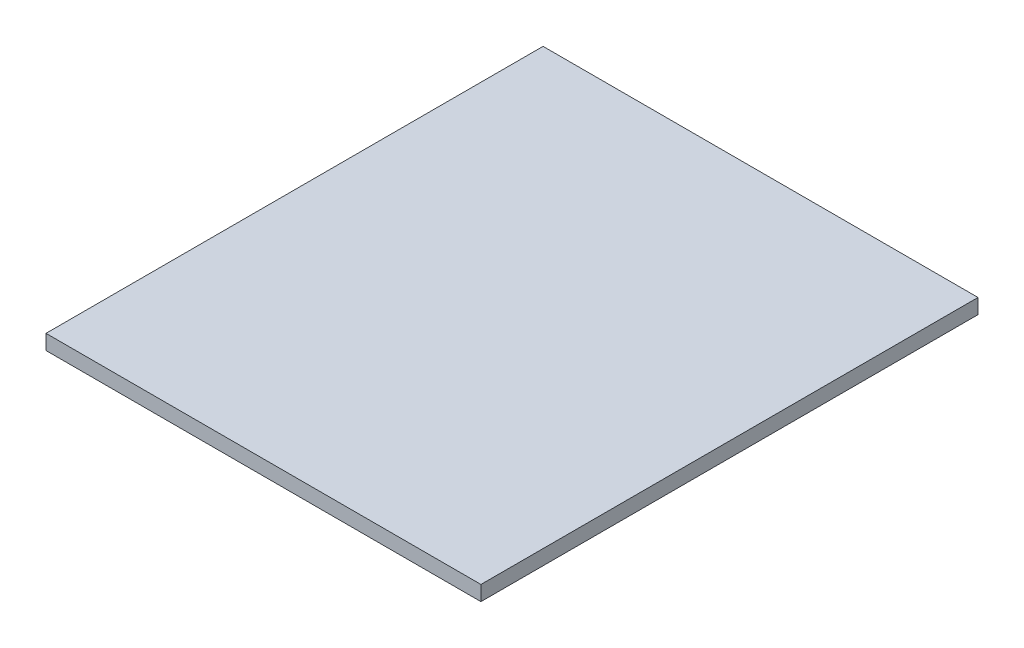
ISO-10303-21;
HEADER;
FILE_DESCRIPTION(('STEP AP214'),'2;1');
FILE_NAME('part.step','',(''),(''),'','','');
FILE_SCHEMA(('AUTOMOTIVE_DESIGN { 1 0 10303 214 1 1 1 1 }'));
ENDSEC;
DATA;
#1=APPLICATION_CONTEXT('core data for automotive mechanical design processes');
#2=APPLICATION_PROTOCOL_DEFINITION('international standard','automotive_design',2000,#1);
#3=PRODUCT_CONTEXT('',#1,'mechanical');
#4=PRODUCT('Part','Part','',(#3));
#5=PRODUCT_RELATED_PRODUCT_CATEGORY('part','',(#4));
#6=PRODUCT_DEFINITION_FORMATION('','',#4);
#7=PRODUCT_DEFINITION_CONTEXT('part definition',#1,'design');
#8=PRODUCT_DEFINITION('design','',#6,#7);
#9=PRODUCT_DEFINITION_SHAPE('','',#8);
#10=(LENGTH_UNIT() NAMED_UNIT(*) SI_UNIT(.MILLI.,.METRE.));
#11=(NAMED_UNIT(*) PLANE_ANGLE_UNIT() SI_UNIT($,.RADIAN.));
#12=(NAMED_UNIT(*) SI_UNIT($,.STERADIAN.) SOLID_ANGLE_UNIT());
#13=UNCERTAINTY_MEASURE_WITH_UNIT(LENGTH_MEASURE(1.E-05),#10,'distance_accuracy_value','');
#14=(GEOMETRIC_REPRESENTATION_CONTEXT(3) GLOBAL_UNCERTAINTY_ASSIGNED_CONTEXT((#13)) GLOBAL_UNIT_ASSIGNED_CONTEXT((#10,
#11,#12)) REPRESENTATION_CONTEXT('',''));
#15=CARTESIAN_POINT('',(0.,0.,0.));
#16=DIRECTION('',(0.,0.,1.));
#17=DIRECTION('',(1.,0.,0.));
#18=AXIS2_PLACEMENT_3D('',#15,#16,#17);
#19=CARTESIAN_POINT('',(87.4999999999999,6.,100.));
#20=DIRECTION('',(-1.,0.,0.));
#21=DIRECTION('',(0.,0.,1.));
#22=AXIS2_PLACEMENT_3D('',#19,#20,#21);
#23=PLANE('',#22);
#24=DIRECTION('',(0.,0.,-1.));
#25=VECTOR('',#24,1.);
#26=CARTESIAN_POINT('',(87.4999999999999,0.,100.));
#27=LINE('',#26,#25);
#28=CARTESIAN_POINT('',(87.4999999999999,0.,100.));
#29=VERTEX_POINT('',#28);
#30=CARTESIAN_POINT('',(87.4999999999999,0.,-100.));
#31=VERTEX_POINT('',#30);
#32=EDGE_CURVE('E113',#29,#31,#27,.T.);
#33=ORIENTED_EDGE('',*,*,#32,.T.);
#34=DIRECTION('',(0.,-1.,0.));
#35=VECTOR('',#34,1.);
#36=CARTESIAN_POINT('',(87.4999999999999,6.,-100.));
#37=LINE('',#36,#35);
#38=CARTESIAN_POINT('',(87.4999999999999,6.,-100.));
#39=VERTEX_POINT('',#38);
#40=EDGE_CURVE('E11',#39,#31,#37,.T.);
#41=ORIENTED_EDGE('',*,*,#40,.F.);
#42=DIRECTION('',(0.,0.,-1.));
#43=VECTOR('',#42,1.);
#44=CARTESIAN_POINT('',(87.4999999999999,6.,100.));
#45=LINE('',#44,#43);
#46=CARTESIAN_POINT('',(87.4999999999999,6.,100.));
#47=VERTEX_POINT('',#46);
#48=EDGE_CURVE('E97',#47,#39,#45,.T.);
#49=ORIENTED_EDGE('',*,*,#48,.F.);
#50=DIRECTION('',(0.,-1.,0.));
#51=VECTOR('',#50,1.);
#52=CARTESIAN_POINT('',(87.4999999999999,6.,100.));
#53=LINE('',#52,#51);
#54=EDGE_CURVE('E109',#47,#29,#53,.T.);
#55=ORIENTED_EDGE('',*,*,#54,.T.);
#56=EDGE_LOOP('',(#33,#41,#49,#55));
#57=FACE_BOUND('',#56,.T.);
#58=ADVANCED_FACE('F45',(#57),#23,.F.);
#59=CARTESIAN_POINT('',(-87.5000000000001,6.,-100.));
#60=DIRECTION('',(0.,0.,1.));
#61=DIRECTION('',(1.,0.,0.));
#62=AXIS2_PLACEMENT_3D('',#59,#60,#61);
#63=PLANE('',#62);
#64=DIRECTION('',(-1.,0.,0.));
#65=VECTOR('',#64,1.);
#66=CARTESIAN_POINT('',(-87.5000000000001,0.,-100.));
#67=LINE('',#66,#65);
#68=CARTESIAN_POINT('',(-87.5000000000001,0.,-100.));
#69=VERTEX_POINT('',#68);
#70=EDGE_CURVE('E102',#31,#69,#67,.T.);
#71=ORIENTED_EDGE('',*,*,#70,.T.);
#72=DIRECTION('',(0.,-1.,0.));
#73=VECTOR('',#72,1.);
#74=CARTESIAN_POINT('',(-87.5000000000001,6.,-100.));
#75=LINE('',#74,#73);
#76=CARTESIAN_POINT('',(-87.5000000000001,6.,-100.));
#77=VERTEX_POINT('',#76);
#78=EDGE_CURVE('E54',#77,#69,#75,.T.);
#79=ORIENTED_EDGE('',*,*,#78,.F.);
#80=DIRECTION('',(-1.,0.,0.));
#81=VECTOR('',#80,1.);
#82=CARTESIAN_POINT('',(-87.5000000000001,6.,-100.));
#83=LINE('',#82,#81);
#84=EDGE_CURVE('E92',#39,#77,#83,.T.);
#85=ORIENTED_EDGE('',*,*,#84,.F.);
#86=ORIENTED_EDGE('',*,*,#40,.T.);
#87=EDGE_LOOP('',(#71,#79,#85,#86));
#88=FACE_BOUND('',#87,.T.);
#89=ADVANCED_FACE('F101',(#88),#63,.F.);
#90=CARTESIAN_POINT('',(-87.5000000000001,6.,100.));
#91=DIRECTION('',(1.,0.,0.));
#92=DIRECTION('',(0.,0.,-1.));
#93=AXIS2_PLACEMENT_3D('',#90,#91,#92);
#94=PLANE('',#93);
#95=DIRECTION('',(0.,0.,1.));
#96=VECTOR('',#95,1.);
#97=CARTESIAN_POINT('',(-87.5000000000001,0.,100.));
#98=LINE('',#97,#96);
#99=CARTESIAN_POINT('',(-87.5000000000001,0.,100.));
#100=VERTEX_POINT('',#99);
#101=EDGE_CURVE('E79',#69,#100,#98,.T.);
#102=ORIENTED_EDGE('',*,*,#101,.T.);
#103=DIRECTION('',(0.,-1.,0.));
#104=VECTOR('',#103,1.);
#105=CARTESIAN_POINT('',(-87.5000000000001,6.,100.));
#106=LINE('',#105,#104);
#107=CARTESIAN_POINT('',(-87.5000000000001,6.,100.));
#108=VERTEX_POINT('',#107);
#109=EDGE_CURVE('E104',#108,#100,#106,.T.);
#110=ORIENTED_EDGE('',*,*,#109,.F.);
#111=DIRECTION('',(0.,0.,1.));
#112=VECTOR('',#111,1.);
#113=CARTESIAN_POINT('',(-87.5000000000001,6.,100.));
#114=LINE('',#113,#112);
#115=EDGE_CURVE('E95',#77,#108,#114,.T.);
#116=ORIENTED_EDGE('',*,*,#115,.F.);
#117=ORIENTED_EDGE('',*,*,#78,.T.);
#118=EDGE_LOOP('',(#102,#110,#116,#117));
#119=FACE_BOUND('',#118,.T.);
#120=ADVANCED_FACE('F105',(#119),#94,.F.);
#121=CARTESIAN_POINT('',(-87.5000000000001,6.,100.));
#122=DIRECTION('',(0.,0.,-1.));
#123=DIRECTION('',(-1.,0.,0.));
#124=AXIS2_PLACEMENT_3D('',#121,#122,#123);
#125=PLANE('',#124);
#126=DIRECTION('',(1.,0.,0.));
#127=VECTOR('',#126,1.);
#128=CARTESIAN_POINT('',(-87.5000000000001,0.,100.));
#129=LINE('',#128,#127);
#130=EDGE_CURVE('E85',#100,#29,#129,.T.);
#131=ORIENTED_EDGE('',*,*,#130,.T.);
#132=ORIENTED_EDGE('',*,*,#54,.F.);
#133=DIRECTION('',(1.,0.,0.));
#134=VECTOR('',#133,1.);
#135=CARTESIAN_POINT('',(-87.5000000000001,6.,100.));
#136=LINE('',#135,#134);
#137=EDGE_CURVE('E62',#108,#47,#136,.T.);
#138=ORIENTED_EDGE('',*,*,#137,.F.);
#139=ORIENTED_EDGE('',*,*,#109,.T.);
#140=EDGE_LOOP('',(#131,#132,#138,#139));
#141=FACE_BOUND('',#140,.T.);
#142=ADVANCED_FACE('F126',(#141),#125,.F.);
#143=CARTESIAN_POINT('',(0.,6.,0.));
#144=DIRECTION('',(0.,-1.,0.));
#145=DIRECTION('',(0.,0.,-1.));
#146=AXIS2_PLACEMENT_3D('',#143,#144,#145);
#147=PLANE('',#146);
#148=ORIENTED_EDGE('',*,*,#48,.T.);
#149=ORIENTED_EDGE('',*,*,#84,.T.);
#150=ORIENTED_EDGE('',*,*,#115,.T.);
#151=ORIENTED_EDGE('',*,*,#137,.T.);
#152=EDGE_LOOP('',(#148,#149,#150,#151));
#153=FACE_BOUND('',#152,.T.);
#154=ADVANCED_FACE('F93',(#153),#147,.F.);
#155=CARTESIAN_POINT('',(0.,0.,0.));
#156=DIRECTION('',(0.,-1.,0.));
#157=DIRECTION('',(0.,0.,-1.));
#158=AXIS2_PLACEMENT_3D('',#155,#156,#157);
#159=PLANE('',#158);
#160=ORIENTED_EDGE('',*,*,#32,.F.);
#161=ORIENTED_EDGE('',*,*,#130,.F.);
#162=ORIENTED_EDGE('',*,*,#101,.F.);
#163=ORIENTED_EDGE('',*,*,#70,.F.);
#164=EDGE_LOOP('',(#160,#161,#162,#163));
#165=FACE_BOUND('',#164,.T.);
#166=ADVANCED_FACE('F129',(#165),#159,.T.);
#167=CLOSED_SHELL('',(#58,#89,#120,#142,#154,#166));
#168=MANIFOLD_SOLID_BREP('B2',#167);
#169=ADVANCED_BREP_SHAPE_REPRESENTATION('',(#18,#168),#14);
#170=SHAPE_DEFINITION_REPRESENTATION(#9,#169);
ENDSEC;
END-ISO-10303-21;
